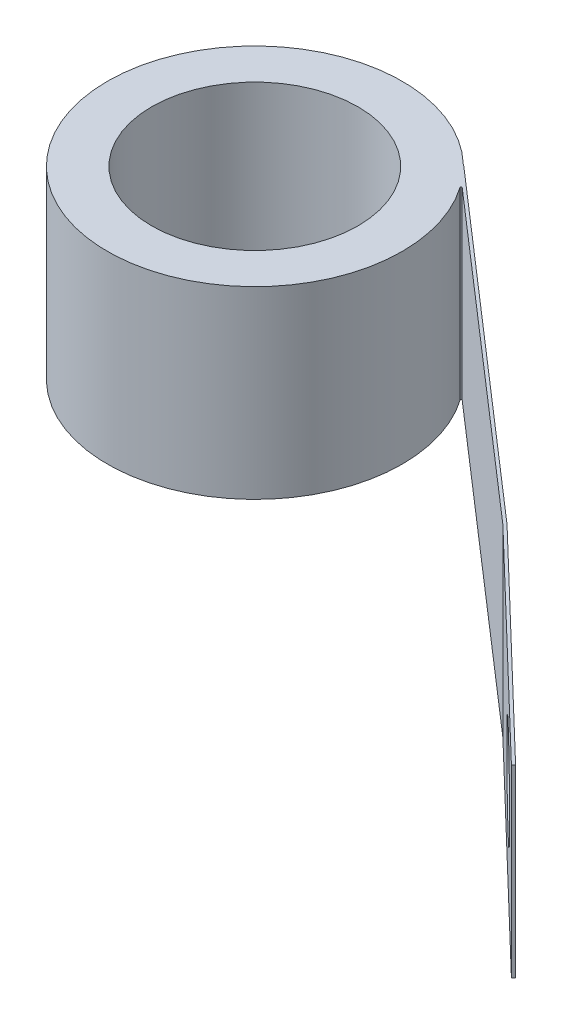
ISO-10303-21;
HEADER;
FILE_DESCRIPTION(('STEP AP214'),'2;1');
FILE_NAME('part.step','',(''),(''),'','','');
FILE_SCHEMA(('AUTOMOTIVE_DESIGN { 1 0 10303 214 1 1 1 1 }'));
ENDSEC;
DATA;
#1=APPLICATION_CONTEXT('core data for automotive mechanical design processes');
#2=APPLICATION_PROTOCOL_DEFINITION('international standard','automotive_design',2000,#1);
#3=PRODUCT_CONTEXT('',#1,'mechanical');
#4=PRODUCT('Part','Part','',(#3));
#5=PRODUCT_RELATED_PRODUCT_CATEGORY('part','',(#4));
#6=PRODUCT_DEFINITION_FORMATION('','',#4);
#7=PRODUCT_DEFINITION_CONTEXT('part definition',#1,'design');
#8=PRODUCT_DEFINITION('design','',#6,#7);
#9=PRODUCT_DEFINITION_SHAPE('','',#8);
#10=(LENGTH_UNIT() NAMED_UNIT(*) SI_UNIT(.MILLI.,.METRE.));
#11=(NAMED_UNIT(*) PLANE_ANGLE_UNIT() SI_UNIT($,.RADIAN.));
#12=(NAMED_UNIT(*) SI_UNIT($,.STERADIAN.) SOLID_ANGLE_UNIT());
#13=UNCERTAINTY_MEASURE_WITH_UNIT(LENGTH_MEASURE(1.E-05),#10,'distance_accuracy_value','');
#14=(GEOMETRIC_REPRESENTATION_CONTEXT(3) GLOBAL_UNCERTAINTY_ASSIGNED_CONTEXT((#13)) GLOBAL_UNIT_ASSIGNED_CONTEXT((#10,
#11,#12)) REPRESENTATION_CONTEXT('',''));
#15=CARTESIAN_POINT('',(0.,0.,0.));
#16=DIRECTION('',(0.,0.,1.));
#17=DIRECTION('',(1.,0.,0.));
#18=AXIS2_PLACEMENT_3D('',#15,#16,#17);
#19=CARTESIAN_POINT('',(0.,6.35,0.));
#20=DIRECTION('',(0.,-1.,0.));
#21=DIRECTION('',(0.,0.,-1.));
#22=AXIS2_PLACEMENT_3D('',#19,#20,#21);
#23=CYLINDRICAL_SURFACE('',#22,5.08);
#24=CARTESIAN_POINT('',(0.,0.,0.));
#25=DIRECTION('',(0.,1.,0.));
#26=DIRECTION('',(0.,0.,1.));
#27=AXIS2_PLACEMENT_3D('',#24,#25,#26);
#28=CIRCLE('',#27,5.08);
#29=CARTESIAN_POINT('',(3.51773674710105,0.,-3.66495950565555));
#30=VERTEX_POINT('',#29);
#31=CARTESIAN_POINT('',(4.16346309736928,0.,-2.91066573773839));
#32=VERTEX_POINT('',#31);
#33=EDGE_CURVE('E141',#30,#32,#28,.T.);
#34=ORIENTED_EDGE('',*,*,#33,.T.);
#35=DIRECTION('',(0.,-1.,0.));
#36=VECTOR('',#35,1.);
#37=CARTESIAN_POINT('',(4.16346309736928,6.35,-2.91066573773839));
#38=LINE('',#37,#36);
#39=CARTESIAN_POINT('',(4.16346309736928,6.35,-2.91066573773839));
#40=VERTEX_POINT('',#39);
#41=EDGE_CURVE('E50',#32,#40,#38,.F.);
#42=ORIENTED_EDGE('',*,*,#41,.T.);
#43=CARTESIAN_POINT('',(0.,6.35,0.));
#44=DIRECTION('',(0.,1.,0.));
#45=DIRECTION('',(0.,0.,1.));
#46=AXIS2_PLACEMENT_3D('',#43,#44,#45);
#47=CIRCLE('',#46,5.08);
#48=CARTESIAN_POINT('',(3.51773674710105,6.35,-3.66495950565555));
#49=VERTEX_POINT('',#48);
#50=EDGE_CURVE('E122',#49,#40,#47,.T.);
#51=ORIENTED_EDGE('',*,*,#50,.F.);
#52=DIRECTION('',(0.,-1.,0.));
#53=VECTOR('',#52,1.);
#54=CARTESIAN_POINT('',(3.51773674710105,6.35,-3.66495950565555));
#55=LINE('',#54,#53);
#56=EDGE_CURVE('E140',#49,#30,#55,.T.);
#57=ORIENTED_EDGE('',*,*,#56,.T.);
#58=EDGE_LOOP('',(#34,#42,#51,#57));
#59=FACE_BOUND('',#58,.T.);
#60=ADVANCED_FACE('F35',(#59),#23,.T.);
#61=CARTESIAN_POINT('',(3.26710430586083,6.35,-3.75655615913192));
#62=DIRECTION('',(-0.656239759634812,0.,0.754552435470487));
#63=DIRECTION('',(0.754552435470487,0.,0.656239759634812));
#64=AXIS2_PLACEMENT_3D('',#61,#62,#63);
#65=PLANE('',#64);
#66=DIRECTION('',(-0.754552435470487,0.,-0.656239759634812));
#67=VECTOR('',#66,1.);
#68=CARTESIAN_POINT('',(3.26710430586083,6.35,-3.75655615913192));
#69=LINE('',#68,#67);
#70=CARTESIAN_POINT('',(14.9648660257865,6.35,6.41707257557993));
#71=VERTEX_POINT('',#70);
#72=CARTESIAN_POINT('',(4.20094890275085,6.35,-2.94438469828804));
#73=VERTEX_POINT('',#72);
#74=EDGE_CURVE('E104',#71,#73,#69,.T.);
#75=ORIENTED_EDGE('',*,*,#74,.T.);
#76=DIRECTION('',(0.,-1.,0.));
#77=VECTOR('',#76,1.);
#78=CARTESIAN_POINT('',(4.20094890275085,6.35,-2.94438469828804));
#79=LINE('',#78,#77);
#80=CARTESIAN_POINT('',(4.20094890275085,0.,-2.94438469828804));
#81=VERTEX_POINT('',#80);
#82=EDGE_CURVE('E111',#73,#81,#79,.T.);
#83=ORIENTED_EDGE('',*,*,#82,.T.);
#84=DIRECTION('',(-0.754552435470487,0.,-0.656239759634812));
#85=VECTOR('',#84,1.);
#86=CARTESIAN_POINT('',(3.26710430586083,0.,-3.75655615913192));
#87=LINE('',#86,#85);
#88=CARTESIAN_POINT('',(14.9648660257865,0.,6.41707257557993));
#89=VERTEX_POINT('',#88);
#90=EDGE_CURVE('E106',#89,#81,#87,.T.);
#91=ORIENTED_EDGE('',*,*,#90,.F.);
#92=DIRECTION('',(0.,-1.,0.));
#93=VECTOR('',#92,1.);
#94=CARTESIAN_POINT('',(14.9648660257865,6.35,6.41707257557993));
#95=LINE('',#94,#93);
#96=EDGE_CURVE('E100',#71,#89,#95,.T.);
#97=ORIENTED_EDGE('',*,*,#96,.F.);
#98=EDGE_LOOP('',(#75,#83,#91,#97));
#99=FACE_BOUND('',#98,.T.);
#100=ADVANCED_FACE('F102',(#99),#65,.T.);
#101=CARTESIAN_POINT('',(3.96998750881991,6.35,-4.13613766572321));
#102=DIRECTION('',(-0.692467863602569,0.,0.721448721585737));
#103=DIRECTION('',(0.721448721585737,0.,0.692467863602569));
#104=AXIS2_PLACEMENT_3D('',#101,#102,#103);
#105=PLANE('',#104);
#106=CARTESIAN_POINT('',(19.546065407856,3.175,10.8142435094562));
#107=DIRECTION('',(-0.692467863602569,0.,0.721448721585737));
#108=DIRECTION('',(0.721448721585737,0.,0.692467863602569));
#109=AXIS2_PLACEMENT_3D('',#106,#107,#108);
#110=CIRCLE('',#109,1.651);
#111=CARTESIAN_POINT('',(18.3549535685179,3.175,9.6709790666484));
#112=VERTEX_POINT('',#111);
#113=EDGE_CURVE('E143',#112,#112,#110,.T.);
#114=ORIENTED_EDGE('',*,*,#113,.F.);
#115=EDGE_LOOP('',(#114));
#116=FACE_BOUND('',#115,.T.);
#117=DIRECTION('',(-0.721448721585737,0.,-0.692467863602569));
#118=VECTOR('',#117,1.);
#119=CARTESIAN_POINT('',(3.96998750881991,0.,-4.13613766572321));
#120=LINE('',#119,#118);
#121=CARTESIAN_POINT('',(22.2947850370976,0.,13.452546069782));
#122=VERTEX_POINT('',#121);
#123=EDGE_CURVE('E145',#122,#89,#120,.T.);
#124=ORIENTED_EDGE('',*,*,#123,.F.);
#125=DIRECTION('',(0.,-1.,0.));
#126=VECTOR('',#125,1.);
#127=CARTESIAN_POINT('',(22.2947850370976,6.35,13.452546069782));
#128=LINE('',#127,#126);
#129=CARTESIAN_POINT('',(22.2947850370976,6.35,13.452546069782));
#130=VERTEX_POINT('',#129);
#131=EDGE_CURVE('E112',#130,#122,#128,.T.);
#132=ORIENTED_EDGE('',*,*,#131,.F.);
#133=DIRECTION('',(-0.721448721585737,0.,-0.692467863602569));
#134=VECTOR('',#133,1.);
#135=CARTESIAN_POINT('',(3.96998750881991,6.35,-4.13613766572321));
#136=LINE('',#135,#134);
#137=EDGE_CURVE('E119',#130,#71,#136,.T.);
#138=ORIENTED_EDGE('',*,*,#137,.T.);
#139=ORIENTED_EDGE('',*,*,#96,.T.);
#140=EDGE_LOOP('',(#124,#132,#138,#139));
#141=FACE_BOUND('',#140,.T.);
#142=ADVANCED_FACE('F124',(#116,#141),#105,.T.);
#143=CARTESIAN_POINT('',(18.3247975282774,6.35,17.5886837355054));
#144=DIRECTION('',(0.721448721585727,0.,0.692467863602579));
#145=DIRECTION('',(0.692467863602579,0.,-0.721448721585727));
#146=AXIS2_PLACEMENT_3D('',#143,#144,#145);
#147=PLANE('',#146);
#148=DIRECTION('',(-0.692467863602579,0.,0.721448721585727));
#149=VECTOR('',#148,1.);
#150=CARTESIAN_POINT('',(18.3247975282774,0.,17.5886837355054));
#151=LINE('',#150,#149);
#152=CARTESIAN_POINT('',(22.3651397720397,0.,13.3792468796689));
#153=VERTEX_POINT('',#152);
#154=EDGE_CURVE('E147',#153,#122,#151,.T.);
#155=ORIENTED_EDGE('',*,*,#154,.F.);
#156=DIRECTION('',(0.,-1.,0.));
#157=VECTOR('',#156,1.);
#158=CARTESIAN_POINT('',(22.3651397720397,6.35,13.3792468796689));
#159=LINE('',#158,#157);
#160=CARTESIAN_POINT('',(22.3651397720397,6.35,13.3792468796689));
#161=VERTEX_POINT('',#160);
#162=EDGE_CURVE('E167',#161,#153,#159,.T.);
#163=ORIENTED_EDGE('',*,*,#162,.F.);
#164=DIRECTION('',(-0.692467863602579,0.,0.721448721585727));
#165=VECTOR('',#164,1.);
#166=CARTESIAN_POINT('',(18.3247975282774,6.35,17.5886837355054));
#167=LINE('',#166,#165);
#168=EDGE_CURVE('E125',#161,#130,#167,.T.);
#169=ORIENTED_EDGE('',*,*,#168,.T.);
#170=ORIENTED_EDGE('',*,*,#131,.T.);
#171=EDGE_LOOP('',(#155,#163,#169,#170));
#172=FACE_BOUND('',#171,.T.);
#173=ADVANCED_FACE('F178',(#172),#147,.T.);
#174=CARTESIAN_POINT('',(4.04034224376193,6.35,-4.20943685583632));
#175=DIRECTION('',(-0.692467863602569,0.,0.721448721585737));
#176=DIRECTION('',(0.721448721585737,0.,0.692467863602569));
#177=AXIS2_PLACEMENT_3D('',#174,#175,#176);
#178=PLANE('',#177);
#179=CARTESIAN_POINT('',(19.616420142798,3.175,10.7409443193432));
#180=DIRECTION('',(0.69246786360257,0.,-0.721448721585736));
#181=DIRECTION('',(-0.721448721585736,0.,-0.69246786360257));
#182=AXIS2_PLACEMENT_3D('',#179,#180,#181);
#183=CIRCLE('',#182,1.651);
#184=CARTESIAN_POINT('',(18.4253083034599,3.175,9.59767987653531));
#185=VERTEX_POINT('',#184);
#186=EDGE_CURVE('E302',#185,#185,#183,.T.);
#187=ORIENTED_EDGE('',*,*,#186,.F.);
#188=EDGE_LOOP('',(#187));
#189=FACE_BOUND('',#188,.T.);
#190=DIRECTION('',(-0.721448721585737,0.,-0.692467863602569));
#191=VECTOR('',#190,1.);
#192=CARTESIAN_POINT('',(4.04034224376193,0.,-4.20943685583632));
#193=LINE('',#192,#191);
#194=CARTESIAN_POINT('',(15.0352207607286,0.,6.34377338546682));
#195=VERTEX_POINT('',#194);
#196=EDGE_CURVE('E150',#153,#195,#193,.T.);
#197=ORIENTED_EDGE('',*,*,#196,.T.);
#198=DIRECTION('',(0.,-1.,0.));
#199=VECTOR('',#198,1.);
#200=CARTESIAN_POINT('',(15.0352207607286,6.35,6.34377338546682));
#201=LINE('',#200,#199);
#202=CARTESIAN_POINT('',(15.0352207607286,6.35,6.34377338546682));
#203=VERTEX_POINT('',#202);
#204=EDGE_CURVE('E164',#203,#195,#201,.T.);
#205=ORIENTED_EDGE('',*,*,#204,.F.);
#206=DIRECTION('',(-0.721448721585737,0.,-0.692467863602569));
#207=VECTOR('',#206,1.);
#208=CARTESIAN_POINT('',(4.04034224376193,6.35,-4.20943685583632));
#209=LINE('',#208,#207);
#210=EDGE_CURVE('E127',#161,#203,#209,.T.);
#211=ORIENTED_EDGE('',*,*,#210,.F.);
#212=ORIENTED_EDGE('',*,*,#162,.T.);
#213=EDGE_LOOP('',(#197,#205,#211,#212));
#214=FACE_BOUND('',#213,.T.);
#215=ADVANCED_FACE('F185',(#189,#214),#178,.F.);
#216=CARTESIAN_POINT('',(3.33369797894485,6.35,-3.83312637219008));
#217=DIRECTION('',(-0.656239759634812,0.,0.754552435470487));
#218=DIRECTION('',(0.754552435470487,0.,0.656239759634812));
#219=AXIS2_PLACEMENT_3D('',#216,#217,#218);
#220=PLANE('',#219);
#221=DIRECTION('',(-0.754552435470487,0.,-0.656239759634812));
#222=VECTOR('',#221,1.);
#223=CARTESIAN_POINT('',(3.33369797894485,0.,-3.83312637219008));
#224=LINE('',#223,#222);
#225=CARTESIAN_POINT('',(3.52197779193676,0.,-3.66937804481922));
#226=VERTEX_POINT('',#225);
#227=EDGE_CURVE('E152',#195,#226,#224,.T.);
#228=ORIENTED_EDGE('',*,*,#227,.T.);
#229=DIRECTION('',(0.,-1.,0.));
#230=VECTOR('',#229,1.);
#231=CARTESIAN_POINT('',(3.52197779193676,6.35,-3.66937804481922));
#232=LINE('',#231,#230);
#233=CARTESIAN_POINT('',(3.52197779193676,6.35,-3.66937804481922));
#234=VERTEX_POINT('',#233);
#235=EDGE_CURVE('E162',#234,#226,#232,.T.);
#236=ORIENTED_EDGE('',*,*,#235,.F.);
#237=DIRECTION('',(-0.754552435470487,0.,-0.656239759634812));
#238=VECTOR('',#237,1.);
#239=CARTESIAN_POINT('',(3.33369797894485,6.35,-3.83312637219008));
#240=LINE('',#239,#238);
#241=EDGE_CURVE('E132',#203,#234,#240,.T.);
#242=ORIENTED_EDGE('',*,*,#241,.F.);
#243=ORIENTED_EDGE('',*,*,#204,.T.);
#244=EDGE_LOOP('',(#228,#236,#242,#243));
#245=FACE_BOUND('',#244,.T.);
#246=ADVANCED_FACE('F187',(#245),#220,.F.);
#247=CARTESIAN_POINT('',(0.,6.35,0.));
#248=DIRECTION('',(-0.721448721585737,0.,-0.692467863602568));
#249=DIRECTION('',(-0.692467863602568,0.,0.721448721585737));
#250=AXIS2_PLACEMENT_3D('',#247,#248,#249);
#251=PLANE('',#250);
#252=DIRECTION('',(0.692467863602568,0.,-0.721448721585737));
#253=VECTOR('',#252,1.);
#254=CARTESIAN_POINT('',(0.,0.,0.));
#255=LINE('',#254,#253);
#256=EDGE_CURVE('E155',#30,#226,#255,.T.);
#257=ORIENTED_EDGE('',*,*,#256,.F.);
#258=ORIENTED_EDGE('',*,*,#56,.F.);
#259=DIRECTION('',(0.692467863602568,0.,-0.721448721585737));
#260=VECTOR('',#259,1.);
#261=CARTESIAN_POINT('',(0.,6.35,0.));
#262=LINE('',#261,#260);
#263=EDGE_CURVE('E134',#49,#234,#262,.T.);
#264=ORIENTED_EDGE('',*,*,#263,.T.);
#265=ORIENTED_EDGE('',*,*,#235,.T.);
#266=EDGE_LOOP('',(#257,#258,#264,#265));
#267=FACE_BOUND('',#266,.T.);
#268=ADVANCED_FACE('F190',(#267),#251,.T.);
#269=CARTESIAN_POINT('',(0.,6.35,0.));
#270=DIRECTION('',(0.,-1.,0.));
#271=DIRECTION('',(0.,0.,-1.));
#272=AXIS2_PLACEMENT_3D('',#269,#270,#271);
#273=CYLINDRICAL_SURFACE('',#272,3.556);
#274=CARTESIAN_POINT('',(0.,6.35,0.));
#275=DIRECTION('',(0.,1.,0.));
#276=DIRECTION('',(0.,0.,1.));
#277=AXIS2_PLACEMENT_3D('',#274,#275,#276);
#278=CIRCLE('',#277,3.556);
#279=CARTESIAN_POINT('',(0.,6.35,3.556));
#280=VERTEX_POINT('',#279);
#281=EDGE_CURVE('E137',#280,#280,#278,.T.);
#282=ORIENTED_EDGE('',*,*,#281,.T.);
#283=EDGE_LOOP('',(#282));
#284=FACE_BOUND('',#283,.T.);
#285=CARTESIAN_POINT('',(0.,0.,0.));
#286=DIRECTION('',(0.,1.,0.));
#287=DIRECTION('',(0.,0.,1.));
#288=AXIS2_PLACEMENT_3D('',#285,#286,#287);
#289=CIRCLE('',#288,3.556);
#290=CARTESIAN_POINT('',(0.,0.,3.556));
#291=VERTEX_POINT('',#290);
#292=EDGE_CURVE('E158',#291,#291,#289,.T.);
#293=ORIENTED_EDGE('',*,*,#292,.F.);
#294=EDGE_LOOP('',(#293));
#295=FACE_BOUND('',#294,.T.);
#296=ADVANCED_FACE('F216',(#284,#295),#273,.F.);
#297=CARTESIAN_POINT('',(0.,6.35,0.));
#298=DIRECTION('',(0.,1.,0.));
#299=DIRECTION('',(0.,0.,1.));
#300=AXIS2_PLACEMENT_3D('',#297,#298,#299);
#301=PLANE('',#300);
#302=ORIENTED_EDGE('',*,*,#50,.T.);
#303=CARTESIAN_POINT('',(4.18428041285613,6.35,-2.92521906642708));
#304=DIRECTION('',(0.,1.,0.));
#305=DIRECTION('',(0.,0.,1.));
#306=AXIS2_PLACEMENT_3D('',#303,#304,#305);
#307=CIRCLE('',#306,0.0254);
#308=EDGE_CURVE('E11',#40,#73,#307,.F.);
#309=ORIENTED_EDGE('',*,*,#308,.T.);
#310=ORIENTED_EDGE('',*,*,#74,.F.);
#311=ORIENTED_EDGE('',*,*,#137,.F.);
#312=ORIENTED_EDGE('',*,*,#168,.F.);
#313=ORIENTED_EDGE('',*,*,#210,.T.);
#314=ORIENTED_EDGE('',*,*,#241,.T.);
#315=ORIENTED_EDGE('',*,*,#263,.F.);
#316=EDGE_LOOP('',(#302,#309,#310,#311,#312,#313,#314,#315));
#317=FACE_BOUND('',#316,.T.);
#318=ORIENTED_EDGE('',*,*,#281,.F.);
#319=EDGE_LOOP('',(#318));
#320=FACE_BOUND('',#319,.T.);
#321=ADVANCED_FACE('F116',(#317,#320),#301,.T.);
#322=CARTESIAN_POINT('',(0.,0.,0.));
#323=DIRECTION('',(0.,1.,0.));
#324=DIRECTION('',(0.,0.,1.));
#325=AXIS2_PLACEMENT_3D('',#322,#323,#324);
#326=PLANE('',#325);
#327=ORIENTED_EDGE('',*,*,#33,.F.);
#328=ORIENTED_EDGE('',*,*,#256,.T.);
#329=ORIENTED_EDGE('',*,*,#227,.F.);
#330=ORIENTED_EDGE('',*,*,#196,.F.);
#331=ORIENTED_EDGE('',*,*,#154,.T.);
#332=ORIENTED_EDGE('',*,*,#123,.T.);
#333=ORIENTED_EDGE('',*,*,#90,.T.);
#334=CARTESIAN_POINT('',(4.18428041285613,0.,-2.92521906642708));
#335=DIRECTION('',(0.,1.,0.));
#336=DIRECTION('',(0.,0.,1.));
#337=AXIS2_PLACEMENT_3D('',#334,#335,#336);
#338=CIRCLE('',#337,0.0254);
#339=EDGE_CURVE('E43',#81,#32,#338,.T.);
#340=ORIENTED_EDGE('',*,*,#339,.T.);
#341=EDGE_LOOP('',(#327,#328,#329,#330,#331,#332,#333,#340));
#342=FACE_BOUND('',#341,.T.);
#343=ORIENTED_EDGE('',*,*,#292,.T.);
#344=EDGE_LOOP('',(#343));
#345=FACE_BOUND('',#344,.T.);
#346=ADVANCED_FACE('F172',(#342,#345),#326,.F.);
#347=CARTESIAN_POINT('',(15.2192492089217,3.175,15.3221437014126));
#348=DIRECTION('',(0.69246786360257,0.,-0.721448721585736));
#349=DIRECTION('',(-0.721448721585736,0.,-0.69246786360257));
#350=AXIS2_PLACEMENT_3D('',#347,#348,#349);
#351=CYLINDRICAL_SURFACE('',#350,1.651);
#352=CARTESIAN_POINT('',(18.3549535685179,3.175,9.6709790666484));
#353=CARTESIAN_POINT('',(18.3556864303402,3.175,9.67021553341806));
#354=CARTESIAN_POINT('',(18.3564192921625,3.175,9.66945200018771));
#355=CARTESIAN_POINT('',(18.3578850158072,3.175,9.66792493372702));
#356=CARTESIAN_POINT('',(18.3586178776295,3.175,9.66716140049668));
#357=CARTESIAN_POINT('',(18.3600836012741,3.175,9.66563433403599));
#358=CARTESIAN_POINT('',(18.3608164630964,3.175,9.66487080080564));
#359=CARTESIAN_POINT('',(18.362282186741,3.175,9.66334373434496));
#360=CARTESIAN_POINT('',(18.3630150485634,3.175,9.66258020111461));
#361=CARTESIAN_POINT('',(18.364480772208,3.175,9.66105313465392));
#362=CARTESIAN_POINT('',(18.3652136340303,3.175,9.66028960142358));
#363=CARTESIAN_POINT('',(18.3666793576749,3.175,9.65876253496289));
#364=CARTESIAN_POINT('',(18.3674122194972,3.175,9.65799900173254));
#365=CARTESIAN_POINT('',(18.3688779431419,3.175,9.65647193527185));
#366=CARTESIAN_POINT('',(18.3696108049642,3.175,9.65570840204151));
#367=CARTESIAN_POINT('',(18.3710765286088,3.175,9.65418133558082));
#368=CARTESIAN_POINT('',(18.3718093904311,3.175,9.65341780235048));
#369=CARTESIAN_POINT('',(18.3732751140757,3.175,9.65189073588979));
#370=CARTESIAN_POINT('',(18.374007975898,3.175,9.65112720265944));
#371=CARTESIAN_POINT('',(18.3754736995427,3.175,9.64960013619875));
#372=CARTESIAN_POINT('',(18.376206561365,3.175,9.64883660296841));
#373=CARTESIAN_POINT('',(18.3776722850096,3.175,9.64730953650772));
#374=CARTESIAN_POINT('',(18.3784051468319,3.175,9.64654600327737));
#375=CARTESIAN_POINT('',(18.3798708704765,3.175,9.64501893681668));
#376=CARTESIAN_POINT('',(18.3806037322989,3.175,9.64425540358634));
#377=CARTESIAN_POINT('',(18.3820694559435,3.175,9.64272833712565));
#378=CARTESIAN_POINT('',(18.3828023177658,3.175,9.64196480389531));
#379=CARTESIAN_POINT('',(18.3842680414104,3.175,9.64043773743462));
#380=CARTESIAN_POINT('',(18.3850009032327,3.175,9.63967420420427));
#381=CARTESIAN_POINT('',(18.3864666268774,3.175,9.63814713774358));
#382=CARTESIAN_POINT('',(18.3871994886997,3.175,9.63738360451324));
#383=CARTESIAN_POINT('',(18.3886652123443,3.175,9.63585653805255));
#384=CARTESIAN_POINT('',(18.3893980741666,3.175,9.6350930048222));
#385=CARTESIAN_POINT('',(18.3908637978112,3.175,9.63356593836152));
#386=CARTESIAN_POINT('',(18.3915966596335,3.175,9.63280240513117));
#387=CARTESIAN_POINT('',(18.3930623832782,3.175,9.63127533867048));
#388=CARTESIAN_POINT('',(18.3937952451005,3.175,9.63051180544013));
#389=CARTESIAN_POINT('',(18.3952609687451,3.175,9.62898473897945));
#390=CARTESIAN_POINT('',(18.3959938305674,3.175,9.6282212057491));
#391=CARTESIAN_POINT('',(18.397459554212,3.175,9.62669413928841));
#392=CARTESIAN_POINT('',(18.3981924160344,3.175,9.62593060605807));
#393=CARTESIAN_POINT('',(18.399658139679,3.175,9.62440353959738));
#394=CARTESIAN_POINT('',(18.4003910015013,3.175,9.62364000636703));
#395=CARTESIAN_POINT('',(18.4018567251459,3.175,9.62211293990634));
#396=CARTESIAN_POINT('',(18.4025895869682,3.175,9.621349406676));
#397=CARTESIAN_POINT('',(18.4040553106129,3.175,9.61982234021531));
#398=CARTESIAN_POINT('',(18.4047881724352,3.175,9.61905880698496));
#399=CARTESIAN_POINT('',(18.4062538960798,3.175,9.61753174052428));
#400=CARTESIAN_POINT('',(18.4069867579021,3.175,9.61676820729393));
#401=CARTESIAN_POINT('',(18.4084524815467,3.175,9.61524114083324));
#402=CARTESIAN_POINT('',(18.409185343369,3.175,9.6144776076029));
#403=CARTESIAN_POINT('',(18.4106510670137,3.175,9.61295054114221));
#404=CARTESIAN_POINT('',(18.411383928836,3.175,9.61218700791186));
#405=CARTESIAN_POINT('',(18.4128496524806,3.175,9.61065994145117));
#406=CARTESIAN_POINT('',(18.4135825143029,3.175,9.60989640822083));
#407=CARTESIAN_POINT('',(18.4150482379475,3.175,9.60836934176014));
#408=CARTESIAN_POINT('',(18.4157810997699,3.175,9.6076058085298));
#409=CARTESIAN_POINT('',(18.4172468234145,3.175,9.60607874206911));
#410=CARTESIAN_POINT('',(18.4179796852368,3.175,9.60531520883876));
#411=CARTESIAN_POINT('',(18.4194454088814,3.175,9.60378814237807));
#412=CARTESIAN_POINT('',(18.4201782707037,3.175,9.60302460914773));
#413=CARTESIAN_POINT('',(18.4216439943484,3.175,9.60149754268704));
#414=CARTESIAN_POINT('',(18.4223768561707,3.175,9.60073400945669));
#415=CARTESIAN_POINT('',(18.4238425798153,3.175,9.59920694299601));
#416=CARTESIAN_POINT('',(18.4245754416376,3.175,9.59844340976566));
#417=CARTESIAN_POINT('',(18.4253083034599,3.175,9.59767987653531));
#418=B_SPLINE_CURVE_WITH_KNOTS('',3,(#352,#353,#354,#355,#356,#357,#358,#359,#360,#361,#362,
#363,#364,#365,#366,#367,#368,#369,#370,#371,#372,#373,#374,#375,#376,#377,#378,#379,#380,#381,
#382,#383,#384,#385,#386,#387,#388,#389,#390,#391,#392,#393,#394,#395,#396,#397,#398,#399,#400,
#401,#402,#403,#404,#405,#406,#407,#408,#409,#410,#411,#412,#413,#414,#415,#416,#417),
.UNSPECIFIED.,.F.,.F.,(4,2,2,2,2,2,2,2,2,2,2,2,2,2,2,2,2,2,2,2,2,2,2,2,2,2,2,2,2,2,2,2,4),(0.,
0.00317499999999827,0.00634999999999654,0.00952499999999606,0.0126999999999943,
0.0158749999999926,0.0190499999999921,0.0222249999999916,0.0253999999999923,0.0285749999999882,
0.0317499999999901,0.0349249999999896,0.0380999999999879,0.0412749999999862,0.0444499999999857,
0.047624999999984,0.0507999999999822,0.0539749999999817,0.0571499999999813,0.0603249999999795,
0.0634999999999778,0.0666749999999797,0.0698499999999769,0.0730249999999775,0.0761999999999758,
0.0793749999999753,0.0825499999999736,0.0857249999999731,0.0888999999999714,0.0920749999999709,
0.0952499999999692,0.0984249999999675,0.101599999999967),.UNSPECIFIED.);
#419=EDGE_CURVE('BSEAM192',#112,#185,#418,.T.);
#420=ORIENTED_EDGE('',*,*,#113,.T.);
#421=ORIENTED_EDGE('',*,*,#186,.T.);
#422=ORIENTED_EDGE('',*,*,#419,.T.);
#423=ORIENTED_EDGE('',*,*,#419,.F.);
#424=EDGE_LOOP('',(#420,#422,#421,#423));
#425=FACE_BOUND('',#424,.T.);
#426=ADVANCED_FACE('F192',(#425),#351,.F.);
#427=CARTESIAN_POINT('',(4.18428041285613,6.35,-2.92521906642708));
#428=DIRECTION('',(0.,-1.,0.));
#429=DIRECTION('',(0.,0.,-1.));
#430=AXIS2_PLACEMENT_3D('',#427,#428,#429);
#431=CYLINDRICAL_SURFACE('',#430,0.0254);
#432=ORIENTED_EDGE('',*,*,#308,.F.);
#433=ORIENTED_EDGE('',*,*,#41,.F.);
#434=ORIENTED_EDGE('',*,*,#339,.F.);
#435=ORIENTED_EDGE('',*,*,#82,.F.);
#436=EDGE_LOOP('',(#432,#433,#434,#435));
#437=FACE_BOUND('',#436,.T.);
#438=ADVANCED_FACE('F37',(#437),#431,.F.);
#439=CLOSED_SHELL('',(#60,#100,#142,#173,#215,#246,#268,#296,#321,#346,#426,#438));
#440=MANIFOLD_SOLID_BREP('B2',#439);
#441=ADVANCED_BREP_SHAPE_REPRESENTATION('',(#18,#440),#14);
#442=SHAPE_DEFINITION_REPRESENTATION(#9,#441);
ENDSEC;
END-ISO-10303-21;
